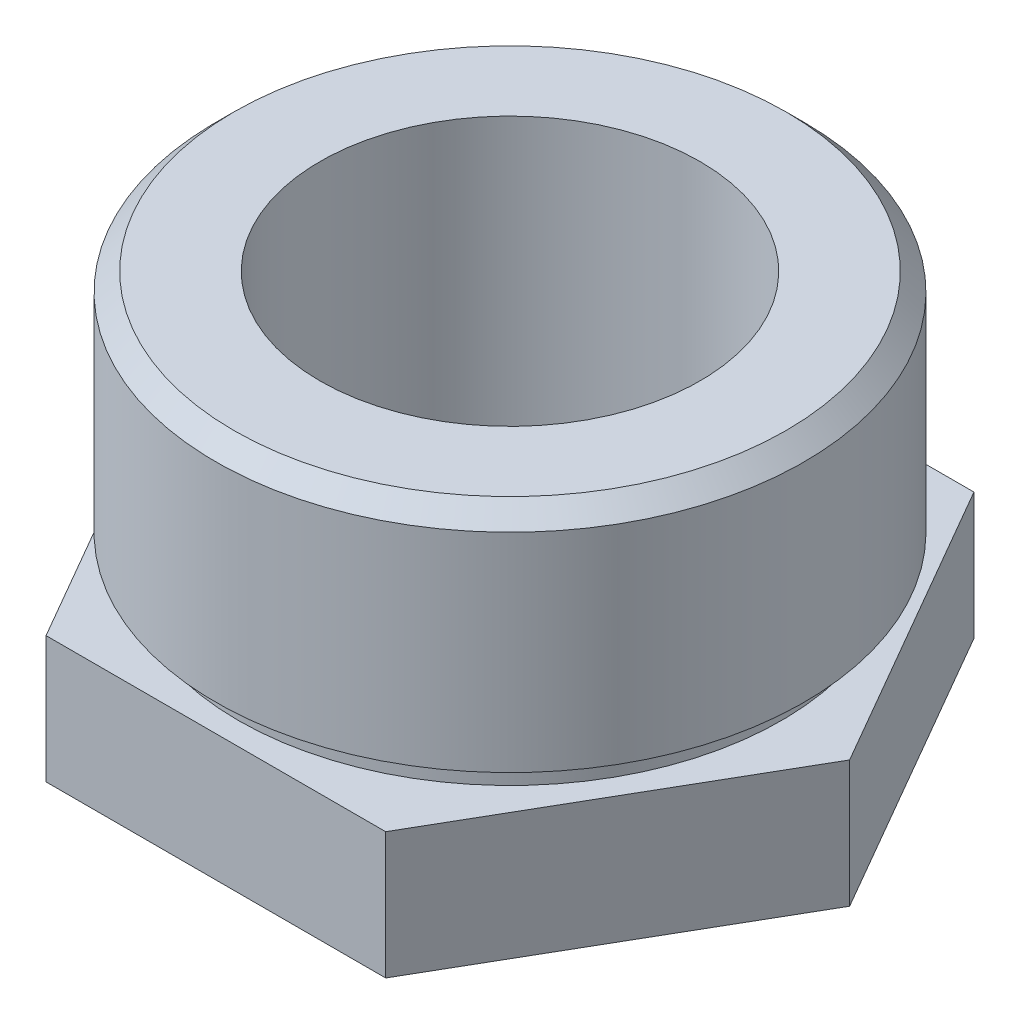
ISO-10303-21;
HEADER;
FILE_DESCRIPTION(('STEP AP214'),'2;1');
FILE_NAME('part.step','',(''),(''),'','','');
FILE_SCHEMA(('AUTOMOTIVE_DESIGN { 1 0 10303 214 1 1 1 1 }'));
ENDSEC;
DATA;
#1=APPLICATION_CONTEXT('core data for automotive mechanical design processes');
#2=APPLICATION_PROTOCOL_DEFINITION('international standard','automotive_design',2000,#1);
#3=PRODUCT_CONTEXT('',#1,'mechanical');
#4=PRODUCT('Part','Part','',(#3));
#5=PRODUCT_RELATED_PRODUCT_CATEGORY('part','',(#4));
#6=PRODUCT_DEFINITION_FORMATION('','',#4);
#7=PRODUCT_DEFINITION_CONTEXT('part definition',#1,'design');
#8=PRODUCT_DEFINITION('design','',#6,#7);
#9=PRODUCT_DEFINITION_SHAPE('','',#8);
#10=(LENGTH_UNIT() NAMED_UNIT(*) SI_UNIT(.MILLI.,.METRE.));
#11=(NAMED_UNIT(*) PLANE_ANGLE_UNIT() SI_UNIT($,.RADIAN.));
#12=(NAMED_UNIT(*) SI_UNIT($,.STERADIAN.) SOLID_ANGLE_UNIT());
#13=UNCERTAINTY_MEASURE_WITH_UNIT(LENGTH_MEASURE(1.E-05),#10,'distance_accuracy_value','');
#14=(GEOMETRIC_REPRESENTATION_CONTEXT(3) GLOBAL_UNCERTAINTY_ASSIGNED_CONTEXT((#13)) GLOBAL_UNIT_ASSIGNED_CONTEXT((#10,
#11,#12)) REPRESENTATION_CONTEXT('',''));
#15=CARTESIAN_POINT('',(0.,0.,0.));
#16=DIRECTION('',(0.,0.,1.));
#17=DIRECTION('',(1.,0.,0.));
#18=AXIS2_PLACEMENT_3D('',#15,#16,#17);
#19=CARTESIAN_POINT('',(-28.1458256229943,14.,16.25));
#20=DIRECTION('',(0.866025403784438,0.,-0.5));
#21=DIRECTION('',(-0.5,0.,-0.866025403784438));
#22=AXIS2_PLACEMENT_3D('',#19,#20,#21);
#23=PLANE('',#22);
#24=DIRECTION('',(0.5,0.,0.866025403784438));
#25=VECTOR('',#24,1.);
#26=CARTESIAN_POINT('',(-28.1458256229943,0.,16.25));
#27=LINE('',#26,#25);
#28=CARTESIAN_POINT('',(-37.5277674973257,0.,0.));
#29=VERTEX_POINT('',#28);
#30=CARTESIAN_POINT('',(-18.7638837486629,0.,32.5));
#31=VERTEX_POINT('',#30);
#32=EDGE_CURVE('E139',#29,#31,#27,.T.);
#33=ORIENTED_EDGE('',*,*,#32,.T.);
#34=DIRECTION('',(0.,-1.,0.));
#35=VECTOR('',#34,1.);
#36=CARTESIAN_POINT('',(-18.7638837486629,14.,32.5));
#37=LINE('',#36,#35);
#38=CARTESIAN_POINT('',(-18.7638837486629,14.,32.5));
#39=VERTEX_POINT('',#38);
#40=EDGE_CURVE('E158',#39,#31,#37,.T.);
#41=ORIENTED_EDGE('',*,*,#40,.F.);
#42=DIRECTION('',(0.5,0.,0.866025403784438));
#43=VECTOR('',#42,1.);
#44=CARTESIAN_POINT('',(-28.1458256229943,14.,16.25));
#45=LINE('',#44,#43);
#46=CARTESIAN_POINT('',(-37.5277674973257,14.,0.));
#47=VERTEX_POINT('',#46);
#48=EDGE_CURVE('E106',#47,#39,#45,.T.);
#49=ORIENTED_EDGE('',*,*,#48,.F.);
#50=DIRECTION('',(0.,-1.,0.));
#51=VECTOR('',#50,1.);
#52=CARTESIAN_POINT('',(-37.5277674973257,14.,0.));
#53=LINE('',#52,#51);
#54=EDGE_CURVE('E135',#47,#29,#53,.T.);
#55=ORIENTED_EDGE('',*,*,#54,.T.);
#56=EDGE_LOOP('',(#33,#41,#49,#55));
#57=FACE_BOUND('',#56,.T.);
#58=ADVANCED_FACE('F53',(#57),#23,.F.);
#59=CARTESIAN_POINT('',(0.,14.,32.5));
#60=DIRECTION('',(0.,0.,-1.));
#61=DIRECTION('',(-1.,0.,0.));
#62=AXIS2_PLACEMENT_3D('',#59,#60,#61);
#63=PLANE('',#62);
#64=DIRECTION('',(1.,0.,0.));
#65=VECTOR('',#64,1.);
#66=CARTESIAN_POINT('',(0.,0.,32.5));
#67=LINE('',#66,#65);
#68=CARTESIAN_POINT('',(18.7638837486628,0.,32.5));
#69=VERTEX_POINT('',#68);
#70=EDGE_CURVE('E141',#31,#69,#67,.T.);
#71=ORIENTED_EDGE('',*,*,#70,.T.);
#72=DIRECTION('',(0.,-1.,0.));
#73=VECTOR('',#72,1.);
#74=CARTESIAN_POINT('',(18.7638837486628,14.,32.5));
#75=LINE('',#74,#73);
#76=CARTESIAN_POINT('',(18.7638837486628,14.,32.5));
#77=VERTEX_POINT('',#76);
#78=EDGE_CURVE('E155',#77,#69,#75,.T.);
#79=ORIENTED_EDGE('',*,*,#78,.F.);
#80=DIRECTION('',(1.,0.,0.));
#81=VECTOR('',#80,1.);
#82=CARTESIAN_POINT('',(0.,14.,32.5));
#83=LINE('',#82,#81);
#84=EDGE_CURVE('E232',#39,#77,#83,.T.);
#85=ORIENTED_EDGE('',*,*,#84,.F.);
#86=ORIENTED_EDGE('',*,*,#40,.T.);
#87=EDGE_LOOP('',(#71,#79,#85,#86));
#88=FACE_BOUND('',#87,.T.);
#89=ADVANCED_FACE('F177',(#88),#63,.F.);
#90=CARTESIAN_POINT('',(28.1458256229943,14.,16.25));
#91=DIRECTION('',(-0.866025403784439,0.,-0.5));
#92=DIRECTION('',(-0.5,0.,0.866025403784439));
#93=AXIS2_PLACEMENT_3D('',#90,#91,#92);
#94=PLANE('',#93);
#95=DIRECTION('',(0.5,0.,-0.866025403784439));
#96=VECTOR('',#95,1.);
#97=CARTESIAN_POINT('',(28.1458256229943,0.,16.25));
#98=LINE('',#97,#96);
#99=CARTESIAN_POINT('',(37.5277674973257,0.,0.));
#100=VERTEX_POINT('',#99);
#101=EDGE_CURVE('E144',#69,#100,#98,.T.);
#102=ORIENTED_EDGE('',*,*,#101,.T.);
#103=DIRECTION('',(0.,-1.,0.));
#104=VECTOR('',#103,1.);
#105=CARTESIAN_POINT('',(37.5277674973257,14.,0.));
#106=LINE('',#105,#104);
#107=CARTESIAN_POINT('',(37.5277674973257,14.,0.));
#108=VERTEX_POINT('',#107);
#109=EDGE_CURVE('E130',#108,#100,#106,.T.);
#110=ORIENTED_EDGE('',*,*,#109,.F.);
#111=DIRECTION('',(0.5,0.,-0.866025403784439));
#112=VECTOR('',#111,1.);
#113=CARTESIAN_POINT('',(28.1458256229943,14.,16.25));
#114=LINE('',#113,#112);
#115=EDGE_CURVE('E121',#77,#108,#114,.T.);
#116=ORIENTED_EDGE('',*,*,#115,.F.);
#117=ORIENTED_EDGE('',*,*,#78,.T.);
#118=EDGE_LOOP('',(#102,#110,#116,#117));
#119=FACE_BOUND('',#118,.T.);
#120=ADVANCED_FACE('F182',(#119),#94,.F.);
#121=CARTESIAN_POINT('',(28.1458256229943,14.,-16.25));
#122=DIRECTION('',(-0.866025403784439,0.,0.5));
#123=DIRECTION('',(0.5,0.,0.866025403784439));
#124=AXIS2_PLACEMENT_3D('',#121,#122,#123);
#125=PLANE('',#124);
#126=DIRECTION('',(-0.5,0.,-0.866025403784439));
#127=VECTOR('',#126,1.);
#128=CARTESIAN_POINT('',(28.1458256229943,0.,-16.25));
#129=LINE('',#128,#127);
#130=CARTESIAN_POINT('',(18.7638837486628,0.,-32.5));
#131=VERTEX_POINT('',#130);
#132=EDGE_CURVE('E129',#100,#131,#129,.T.);
#133=ORIENTED_EDGE('',*,*,#132,.T.);
#134=DIRECTION('',(0.,-1.,0.));
#135=VECTOR('',#134,1.);
#136=CARTESIAN_POINT('',(18.7638837486628,14.,-32.5));
#137=LINE('',#136,#135);
#138=CARTESIAN_POINT('',(18.7638837486628,14.,-32.5));
#139=VERTEX_POINT('',#138);
#140=EDGE_CURVE('E126',#139,#131,#137,.T.);
#141=ORIENTED_EDGE('',*,*,#140,.F.);
#142=DIRECTION('',(-0.5,0.,-0.866025403784439));
#143=VECTOR('',#142,1.);
#144=CARTESIAN_POINT('',(28.1458256229943,14.,-16.25));
#145=LINE('',#144,#143);
#146=EDGE_CURVE('E114',#108,#139,#145,.T.);
#147=ORIENTED_EDGE('',*,*,#146,.F.);
#148=ORIENTED_EDGE('',*,*,#109,.T.);
#149=EDGE_LOOP('',(#133,#141,#147,#148));
#150=FACE_BOUND('',#149,.T.);
#151=ADVANCED_FACE('F127',(#150),#125,.F.);
#152=CARTESIAN_POINT('',(0.,14.,-32.5));
#153=DIRECTION('',(0.,0.,1.));
#154=DIRECTION('',(1.,0.,0.));
#155=AXIS2_PLACEMENT_3D('',#152,#153,#154);
#156=PLANE('',#155);
#157=DIRECTION('',(-1.,0.,0.));
#158=VECTOR('',#157,1.);
#159=CARTESIAN_POINT('',(0.,0.,-32.5));
#160=LINE('',#159,#158);
#161=CARTESIAN_POINT('',(-18.7638837486629,0.,-32.5));
#162=VERTEX_POINT('',#161);
#163=EDGE_CURVE('E94',#131,#162,#160,.T.);
#164=ORIENTED_EDGE('',*,*,#163,.T.);
#165=DIRECTION('',(0.,-1.,0.));
#166=VECTOR('',#165,1.);
#167=CARTESIAN_POINT('',(-18.7638837486629,14.,-32.5));
#168=LINE('',#167,#166);
#169=CARTESIAN_POINT('',(-18.7638837486629,14.,-32.5));
#170=VERTEX_POINT('',#169);
#171=EDGE_CURVE('E131',#170,#162,#168,.T.);
#172=ORIENTED_EDGE('',*,*,#171,.F.);
#173=DIRECTION('',(-1.,0.,0.));
#174=VECTOR('',#173,1.);
#175=CARTESIAN_POINT('',(0.,14.,-32.5));
#176=LINE('',#175,#174);
#177=EDGE_CURVE('E119',#139,#170,#176,.T.);
#178=ORIENTED_EDGE('',*,*,#177,.F.);
#179=ORIENTED_EDGE('',*,*,#140,.T.);
#180=EDGE_LOOP('',(#164,#172,#178,#179));
#181=FACE_BOUND('',#180,.T.);
#182=ADVANCED_FACE('F133',(#181),#156,.F.);
#183=CARTESIAN_POINT('',(-28.1458256229943,14.,-16.25));
#184=DIRECTION('',(0.866025403784439,0.,0.5));
#185=DIRECTION('',(0.5,0.,-0.866025403784439));
#186=AXIS2_PLACEMENT_3D('',#183,#184,#185);
#187=PLANE('',#186);
#188=DIRECTION('',(-0.5,0.,0.866025403784439));
#189=VECTOR('',#188,1.);
#190=CARTESIAN_POINT('',(-28.1458256229943,0.,-16.25));
#191=LINE('',#190,#189);
#192=EDGE_CURVE('E100',#162,#29,#191,.T.);
#193=ORIENTED_EDGE('',*,*,#192,.T.);
#194=ORIENTED_EDGE('',*,*,#54,.F.);
#195=DIRECTION('',(-0.5,0.,0.866025403784439));
#196=VECTOR('',#195,1.);
#197=CARTESIAN_POINT('',(-28.1458256229943,14.,-16.25));
#198=LINE('',#197,#196);
#199=EDGE_CURVE('E71',#170,#47,#198,.T.);
#200=ORIENTED_EDGE('',*,*,#199,.F.);
#201=ORIENTED_EDGE('',*,*,#171,.T.);
#202=EDGE_LOOP('',(#193,#194,#200,#201));
#203=FACE_BOUND('',#202,.T.);
#204=ADVANCED_FACE('F193',(#203),#187,.F.);
#205=CARTESIAN_POINT('',(0.,14.,0.));
#206=DIRECTION('',(0.,-1.,0.));
#207=DIRECTION('',(0.,0.,-1.));
#208=AXIS2_PLACEMENT_3D('',#205,#206,#207);
#209=CYLINDRICAL_SURFACE('',#208,21.);
#210=CARTESIAN_POINT('',(0.,0.,0.));
#211=DIRECTION('',(0.,1.,0.));
#212=DIRECTION('',(0.,0.,1.));
#213=AXIS2_PLACEMENT_3D('',#210,#211,#212);
#214=CIRCLE('',#213,21.);
#215=CARTESIAN_POINT('',(0.,0.,21.));
#216=VERTEX_POINT('',#215);
#217=EDGE_CURVE('E149',#216,#216,#214,.T.);
#218=ORIENTED_EDGE('',*,*,#217,.F.);
#219=EDGE_LOOP('',(#218));
#220=FACE_BOUND('',#219,.T.);
#221=CARTESIAN_POINT('',(0.,42.,0.));
#222=DIRECTION('',(0.,1.,0.));
#223=DIRECTION('',(0.,0.,1.));
#224=AXIS2_PLACEMENT_3D('',#221,#222,#223);
#225=CIRCLE('',#224,21.);
#226=CARTESIAN_POINT('',(0.,42.,21.));
#227=VERTEX_POINT('',#226);
#228=EDGE_CURVE('E142',#227,#227,#225,.T.);
#229=ORIENTED_EDGE('',*,*,#228,.T.);
#230=EDGE_LOOP('',(#229));
#231=FACE_BOUND('',#230,.T.);
#232=ADVANCED_FACE('F196',(#220,#231),#209,.F.);
#233=CARTESIAN_POINT('',(0.,14.,0.));
#234=DIRECTION('',(0.,1.,0.));
#235=DIRECTION('',(0.,0.,1.));
#236=AXIS2_PLACEMENT_3D('',#233,#234,#235);
#237=PLANE('',#236);
#238=ORIENTED_EDGE('',*,*,#115,.T.);
#239=ORIENTED_EDGE('',*,*,#146,.T.);
#240=ORIENTED_EDGE('',*,*,#177,.T.);
#241=ORIENTED_EDGE('',*,*,#199,.T.);
#242=ORIENTED_EDGE('',*,*,#48,.T.);
#243=ORIENTED_EDGE('',*,*,#84,.T.);
#244=EDGE_LOOP('',(#238,#239,#240,#241,#242,#243));
#245=FACE_BOUND('',#244,.T.);
#246=CARTESIAN_POINT('',(0.,14.,0.));
#247=DIRECTION('',(0.,1.,0.));
#248=DIRECTION('',(0.,0.,1.));
#249=AXIS2_PLACEMENT_3D('',#246,#247,#248);
#250=CIRCLE('',#249,30.);
#251=CARTESIAN_POINT('',(0.,14.,30.));
#252=VERTEX_POINT('',#251);
#253=EDGE_CURVE('E223',#252,#252,#250,.T.);
#254=ORIENTED_EDGE('',*,*,#253,.F.);
#255=EDGE_LOOP('',(#254));
#256=FACE_BOUND('',#255,.T.);
#257=ADVANCED_FACE('F116',(#245,#256),#237,.T.);
#258=CARTESIAN_POINT('',(0.,0.,0.));
#259=DIRECTION('',(0.,1.,0.));
#260=DIRECTION('',(0.,0.,1.));
#261=AXIS2_PLACEMENT_3D('',#258,#259,#260);
#262=PLANE('',#261);
#263=ORIENTED_EDGE('',*,*,#101,.F.);
#264=ORIENTED_EDGE('',*,*,#70,.F.);
#265=ORIENTED_EDGE('',*,*,#32,.F.);
#266=ORIENTED_EDGE('',*,*,#192,.F.);
#267=ORIENTED_EDGE('',*,*,#163,.F.);
#268=ORIENTED_EDGE('',*,*,#132,.F.);
#269=EDGE_LOOP('',(#263,#264,#265,#266,#267,#268));
#270=FACE_BOUND('',#269,.T.);
#271=ORIENTED_EDGE('',*,*,#217,.T.);
#272=EDGE_LOOP('',(#271));
#273=FACE_BOUND('',#272,.T.);
#274=ADVANCED_FACE('F200',(#270,#273),#262,.F.);
#275=CARTESIAN_POINT('',(0.,42.,0.));
#276=DIRECTION('',(0.,-1.,0.));
#277=DIRECTION('',(0.,0.,-1.));
#278=AXIS2_PLACEMENT_3D('',#275,#276,#277);
#279=CYLINDRICAL_SURFACE('',#278,32.5);
#280=CARTESIAN_POINT('',(0.,40.0000000000001,0.));
#281=DIRECTION('',(0.,1.,0.));
#282=DIRECTION('',(0.,0.,1.));
#283=AXIS2_PLACEMENT_3D('',#280,#281,#282);
#284=CIRCLE('',#283,32.5);
#285=CARTESIAN_POINT('',(0.,40.0000000000001,-32.5));
#286=VERTEX_POINT('',#285);
#287=EDGE_CURVE('E12',#286,#286,#284,.F.);
#288=CARTESIAN_POINT('',(0.,17.,0.));
#289=DIRECTION('',(0.,1.,0.));
#290=DIRECTION('',(0.,0.,1.));
#291=AXIS2_PLACEMENT_3D('',#288,#289,#290);
#292=CIRCLE('',#291,32.5);
#293=CARTESIAN_POINT('',(0.,17.,-32.5));
#294=VERTEX_POINT('',#293);
#295=EDGE_CURVE('E219',#294,#294,#292,.T.);
#296=CARTESIAN_POINT('',(0.,40.0000000000001,-32.5));
#297=CARTESIAN_POINT('',(0.,39.7604166666667,-32.5));
#298=CARTESIAN_POINT('',(0.,39.5208333333334,-32.5));
#299=CARTESIAN_POINT('',(0.,39.0416666666667,-32.5));
#300=CARTESIAN_POINT('',(0.,38.8020833333334,-32.5));
#301=CARTESIAN_POINT('',(0.,38.3229166666667,-32.5));
#302=CARTESIAN_POINT('',(0.,38.0833333333334,-32.5));
#303=CARTESIAN_POINT('',(0.,37.6041666666667,-32.5));
#304=CARTESIAN_POINT('',(0.,37.3645833333334,-32.5));
#305=CARTESIAN_POINT('',(0.,36.8854166666667,-32.5));
#306=CARTESIAN_POINT('',(0.,36.6458333333334,-32.5));
#307=CARTESIAN_POINT('',(0.,36.1666666666667,-32.5));
#308=CARTESIAN_POINT('',(0.,35.9270833333334,-32.5));
#309=CARTESIAN_POINT('',(0.,35.4479166666667,-32.5));
#310=CARTESIAN_POINT('',(0.,35.2083333333334,-32.5));
#311=CARTESIAN_POINT('',(0.,34.7291666666667,-32.5));
#312=CARTESIAN_POINT('',(0.,34.4895833333334,-32.5));
#313=CARTESIAN_POINT('',(0.,34.0104166666667,-32.5));
#314=CARTESIAN_POINT('',(0.,33.7708333333334,-32.5));
#315=CARTESIAN_POINT('',(0.,33.2916666666667,-32.5));
#316=CARTESIAN_POINT('',(0.,33.0520833333334,-32.5));
#317=CARTESIAN_POINT('',(0.,32.5729166666667,-32.5));
#318=CARTESIAN_POINT('',(0.,32.3333333333334,-32.5));
#319=CARTESIAN_POINT('',(0.,31.8541666666667,-32.5));
#320=CARTESIAN_POINT('',(0.,31.6145833333334,-32.5));
#321=CARTESIAN_POINT('',(0.,31.1354166666667,-32.5));
#322=CARTESIAN_POINT('',(0.,30.8958333333334,-32.5));
#323=CARTESIAN_POINT('',(0.,30.4166666666667,-32.5));
#324=CARTESIAN_POINT('',(0.,30.1770833333334,-32.5));
#325=CARTESIAN_POINT('',(0.,29.6979166666667,-32.5));
#326=CARTESIAN_POINT('',(0.,29.4583333333334,-32.5));
#327=CARTESIAN_POINT('',(0.,28.9791666666667,-32.5));
#328=CARTESIAN_POINT('',(0.,28.7395833333334,-32.5));
#329=CARTESIAN_POINT('',(0.,28.2604166666667,-32.5));
#330=CARTESIAN_POINT('',(0.,28.0208333333334,-32.5));
#331=CARTESIAN_POINT('',(0.,27.5416666666667,-32.5));
#332=CARTESIAN_POINT('',(0.,27.3020833333334,-32.5));
#333=CARTESIAN_POINT('',(0.,26.8229166666667,-32.5));
#334=CARTESIAN_POINT('',(0.,26.5833333333334,-32.5));
#335=CARTESIAN_POINT('',(0.,26.1041666666667,-32.5));
#336=CARTESIAN_POINT('',(0.,25.8645833333334,-32.5));
#337=CARTESIAN_POINT('',(0.,25.3854166666667,-32.5));
#338=CARTESIAN_POINT('',(0.,25.1458333333334,-32.5));
#339=CARTESIAN_POINT('',(0.,24.6666666666667,-32.5));
#340=CARTESIAN_POINT('',(0.,24.4270833333333,-32.5));
#341=CARTESIAN_POINT('',(0.,23.9479166666667,-32.5));
#342=CARTESIAN_POINT('',(0.,23.7083333333333,-32.5));
#343=CARTESIAN_POINT('',(0.,23.2291666666667,-32.5));
#344=CARTESIAN_POINT('',(0.,22.9895833333333,-32.5));
#345=CARTESIAN_POINT('',(0.,22.5104166666667,-32.5));
#346=CARTESIAN_POINT('',(0.,22.2708333333333,-32.5));
#347=CARTESIAN_POINT('',(0.,21.7916666666667,-32.5));
#348=CARTESIAN_POINT('',(0.,21.5520833333333,-32.5));
#349=CARTESIAN_POINT('',(0.,21.0729166666667,-32.5));
#350=CARTESIAN_POINT('',(0.,20.8333333333333,-32.5));
#351=CARTESIAN_POINT('',(0.,20.3541666666667,-32.5));
#352=CARTESIAN_POINT('',(0.,20.1145833333333,-32.5));
#353=CARTESIAN_POINT('',(0.,19.6354166666667,-32.5));
#354=CARTESIAN_POINT('',(0.,19.3958333333333,-32.5));
#355=CARTESIAN_POINT('',(0.,18.9166666666667,-32.5));
#356=CARTESIAN_POINT('',(0.,18.6770833333333,-32.5));
#357=CARTESIAN_POINT('',(0.,18.1979166666667,-32.5));
#358=CARTESIAN_POINT('',(0.,17.9583333333333,-32.5));
#359=CARTESIAN_POINT('',(0.,17.4791666666667,-32.5));
#360=CARTESIAN_POINT('',(0.,17.2395833333333,-32.5));
#361=CARTESIAN_POINT('',(0.,17.,-32.5));
#362=B_SPLINE_CURVE_WITH_KNOTS('',3,(#296,#297,#298,#299,#300,#301,#302,#303,#304,#305,#306,
#307,#308,#309,#310,#311,#312,#313,#314,#315,#316,#317,#318,#319,#320,#321,#322,#323,#324,#325,
#326,#327,#328,#329,#330,#331,#332,#333,#334,#335,#336,#337,#338,#339,#340,#341,#342,#343,#344,
#345,#346,#347,#348,#349,#350,#351,#352,#353,#354,#355,#356,#357,#358,#359,#360,#361),
.UNSPECIFIED.,.F.,.F.,(4,2,2,2,2,2,2,2,2,2,2,2,2,2,2,2,2,2,2,2,2,2,2,2,2,2,2,2,2,2,2,2,4),(0.,
0.718750000000004,1.43750000000001,2.15625000000001,2.87500000000001,3.59375000000001,
4.31250000000001,5.03125000000002,5.75000000000002,6.46875000000002,7.18750000000002,
7.90625000000002,8.62500000000002,9.34375000000002,10.0625,10.78125,11.5,12.21875,12.9375,
13.65625,14.375,15.09375,15.8125,16.53125,17.25,17.96875,18.6875,19.40625,20.1250000000001,
20.8437500000001,21.5625000000001,22.2812500000001,23.0000000000001),.UNSPECIFIED.);
#363=EDGE_CURVE('BSEAM203',#286,#294,#362,.T.);
#364=ORIENTED_EDGE('',*,*,#287,.T.);
#365=ORIENTED_EDGE('',*,*,#295,.T.);
#366=ORIENTED_EDGE('',*,*,#363,.T.);
#367=ORIENTED_EDGE('',*,*,#363,.F.);
#368=EDGE_LOOP('',(#364,#366,#365,#367));
#369=FACE_BOUND('',#368,.T.);
#370=ADVANCED_FACE('F203',(#369),#279,.T.);
#371=CARTESIAN_POINT('',(0.,42.,0.));
#372=DIRECTION('',(0.,1.,0.));
#373=DIRECTION('',(0.,0.,1.));
#374=AXIS2_PLACEMENT_3D('',#371,#372,#373);
#375=PLANE('',#374);
#376=CARTESIAN_POINT('',(0.,42.,0.));
#377=DIRECTION('',(0.,1.,0.));
#378=DIRECTION('',(0.,0.,1.));
#379=AXIS2_PLACEMENT_3D('',#376,#377,#378);
#380=CIRCLE('',#379,30.5000000000001);
#381=CARTESIAN_POINT('',(0.,42.,30.5000000000001));
#382=VERTEX_POINT('',#381);
#383=EDGE_CURVE('E63',#382,#382,#380,.T.);
#384=ORIENTED_EDGE('',*,*,#383,.T.);
#385=EDGE_LOOP('',(#384));
#386=FACE_BOUND('',#385,.T.);
#387=ORIENTED_EDGE('',*,*,#228,.F.);
#388=EDGE_LOOP('',(#387));
#389=FACE_BOUND('',#388,.T.);
#390=ADVANCED_FACE('F163',(#386,#389),#375,.T.);
#391=CARTESIAN_POINT('',(0.,17.,0.));
#392=DIRECTION('',(0.,1.,0.));
#393=DIRECTION('',(0.,0.,1.));
#394=AXIS2_PLACEMENT_3D('',#391,#392,#393);
#395=PLANE('',#394);
#396=ORIENTED_EDGE('',*,*,#295,.F.);
#397=EDGE_LOOP('',(#396));
#398=FACE_BOUND('',#397,.T.);
#399=CARTESIAN_POINT('',(0.,17.,0.));
#400=DIRECTION('',(0.,1.,0.));
#401=DIRECTION('',(0.,0.,1.));
#402=AXIS2_PLACEMENT_3D('',#399,#400,#401);
#403=CIRCLE('',#402,30.);
#404=CARTESIAN_POINT('',(0.,17.,30.));
#405=VERTEX_POINT('',#404);
#406=EDGE_CURVE('E222',#405,#405,#403,.T.);
#407=ORIENTED_EDGE('',*,*,#406,.T.);
#408=EDGE_LOOP('',(#407));
#409=FACE_BOUND('',#408,.T.);
#410=ADVANCED_FACE('F172',(#398,#409),#395,.F.);
#411=CARTESIAN_POINT('',(0.,17.,0.));
#412=DIRECTION('',(0.,-1.,0.));
#413=DIRECTION('',(0.,0.,-1.));
#414=AXIS2_PLACEMENT_3D('',#411,#412,#413);
#415=CYLINDRICAL_SURFACE('',#414,30.);
#416=ORIENTED_EDGE('',*,*,#406,.F.);
#417=EDGE_LOOP('',(#416));
#418=FACE_BOUND('',#417,.T.);
#419=ORIENTED_EDGE('',*,*,#253,.T.);
#420=EDGE_LOOP('',(#419));
#421=FACE_BOUND('',#420,.T.);
#422=ADVANCED_FACE('F167',(#418,#421),#415,.T.);
#423=CARTESIAN_POINT('',(0.,42.,0.));
#424=DIRECTION('',(0.,-1.,0.));
#425=DIRECTION('',(0.,0.,-1.));
#426=AXIS2_PLACEMENT_3D('',#423,#424,#425);
#427=CONICAL_SURFACE('',#426,30.5000000000001,0.785398163397447);
#428=ORIENTED_EDGE('',*,*,#287,.F.);
#429=EDGE_LOOP('',(#428));
#430=FACE_BOUND('',#429,.T.);
#431=ORIENTED_EDGE('',*,*,#383,.F.);
#432=EDGE_LOOP('',(#431));
#433=FACE_BOUND('',#432,.T.);
#434=ADVANCED_FACE('F56',(#430,#433),#427,.T.);
#435=CLOSED_SHELL('',(#58,#89,#120,#151,#182,#204,#232,#257,#274,#370,#390,#410,#422,#434));
#436=MANIFOLD_SOLID_BREP('B2',#435);
#437=ADVANCED_BREP_SHAPE_REPRESENTATION('',(#18,#436),#14);
#438=SHAPE_DEFINITION_REPRESENTATION(#9,#437);
ENDSEC;
END-ISO-10303-21;
